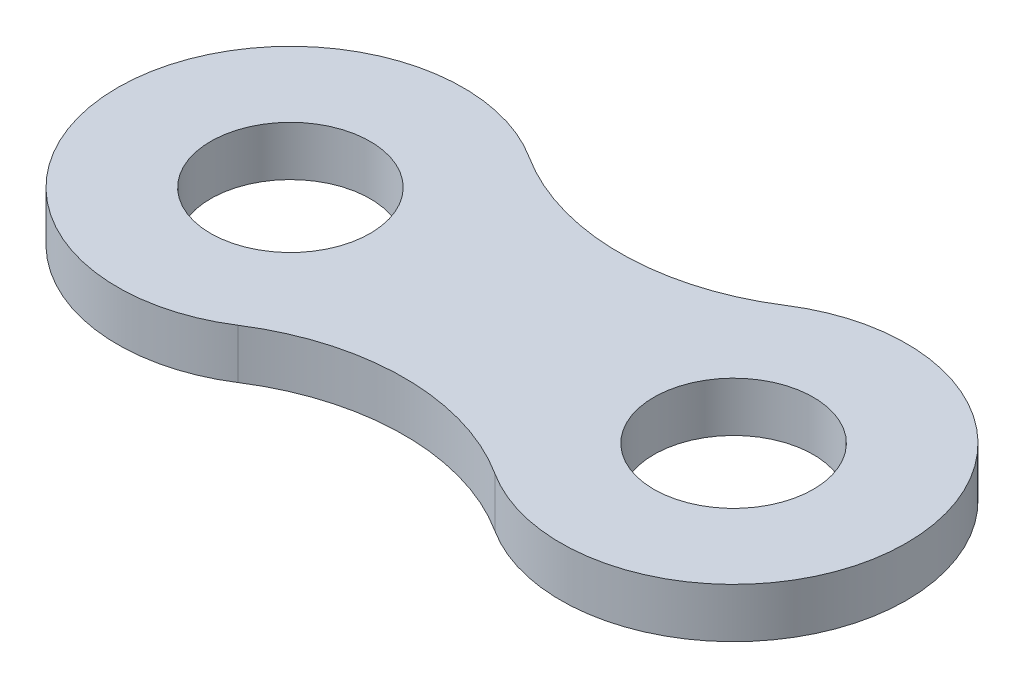
ISO-10303-21;
HEADER;
FILE_DESCRIPTION(('STEP AP214'),'2;1');
FILE_NAME('part.step','',(''),(''),'','','');
FILE_SCHEMA(('AUTOMOTIVE_DESIGN { 1 0 10303 214 1 1 1 1 }'));
ENDSEC;
DATA;
#1=APPLICATION_CONTEXT('core data for automotive mechanical design processes');
#2=APPLICATION_PROTOCOL_DEFINITION('international standard','automotive_design',2000,#1);
#3=PRODUCT_CONTEXT('',#1,'mechanical');
#4=PRODUCT('Part','Part','',(#3));
#5=PRODUCT_RELATED_PRODUCT_CATEGORY('part','',(#4));
#6=PRODUCT_DEFINITION_FORMATION('','',#4);
#7=PRODUCT_DEFINITION_CONTEXT('part definition',#1,'design');
#8=PRODUCT_DEFINITION('design','',#6,#7);
#9=PRODUCT_DEFINITION_SHAPE('','',#8);
#10=(LENGTH_UNIT() NAMED_UNIT(*) SI_UNIT(.MILLI.,.METRE.));
#11=(NAMED_UNIT(*) PLANE_ANGLE_UNIT() SI_UNIT($,.RADIAN.));
#12=(NAMED_UNIT(*) SI_UNIT($,.STERADIAN.) SOLID_ANGLE_UNIT());
#13=UNCERTAINTY_MEASURE_WITH_UNIT(LENGTH_MEASURE(1.E-05),#10,'distance_accuracy_value','');
#14=(GEOMETRIC_REPRESENTATION_CONTEXT(3) GLOBAL_UNCERTAINTY_ASSIGNED_CONTEXT((#13)) GLOBAL_UNIT_ASSIGNED_CONTEXT((#10,
#11,#12)) REPRESENTATION_CONTEXT('',''));
#15=CARTESIAN_POINT('',(0.,0.,0.));
#16=DIRECTION('',(0.,0.,1.));
#17=DIRECTION('',(1.,0.,0.));
#18=AXIS2_PLACEMENT_3D('',#15,#16,#17);
#19=CARTESIAN_POINT('',(4.7625,0.7112,-2.4765));
#20=DIRECTION('',(0.,1.,0.));
#21=DIRECTION('',(0.,0.,1.));
#22=AXIS2_PLACEMENT_3D('',#19,#20,#21);
#23=PLANE('',#22);
#24=CARTESIAN_POINT('',(0.,0.7112,0.));
#25=DIRECTION('',(0.,1.,0.));
#26=DIRECTION('',(0.,0.,1.));
#27=AXIS2_PLACEMENT_3D('',#24,#25,#26);
#28=CIRCLE('',#27,1.143);
#29=CARTESIAN_POINT('',(0.,0.7112,1.143));
#30=VERTEX_POINT('',#29);
#31=EDGE_CURVE('E100',#30,#30,#28,.T.);
#32=ORIENTED_EDGE('',*,*,#31,.F.);
#33=EDGE_LOOP('',(#32));
#34=FACE_BOUND('',#33,.T.);
#35=CARTESIAN_POINT('',(3.175,0.7112,-4.953));
#36=DIRECTION('',(0.,-1.,0.));
#37=DIRECTION('',(0.,0.,1.));
#38=AXIS2_PLACEMENT_3D('',#35,#36,#37);
#39=CIRCLE('',#38,3.40676728952544);
#40=CARTESIAN_POINT('',(5.01351686689485,0.7112,-2.08491368764403));
#41=VERTEX_POINT('',#40);
#42=CARTESIAN_POINT('',(1.33648313310515,0.7112,-2.08491368764403));
#43=VERTEX_POINT('',#42);
#44=EDGE_CURVE('E85',#41,#43,#39,.T.);
#45=ORIENTED_EDGE('',*,*,#44,.T.);
#46=CARTESIAN_POINT('',(0.,0.7112,0.));
#47=DIRECTION('',(0.,1.,0.));
#48=DIRECTION('',(0.,0.,1.));
#49=AXIS2_PLACEMENT_3D('',#46,#47,#48);
#50=CIRCLE('',#49,2.4765);
#51=CARTESIAN_POINT('',(1.33648313310515,0.7112,2.08491368764403));
#52=VERTEX_POINT('',#51);
#53=EDGE_CURVE('E80',#43,#52,#50,.T.);
#54=ORIENTED_EDGE('',*,*,#53,.T.);
#55=CARTESIAN_POINT('',(3.175,0.7112,4.953));
#56=DIRECTION('',(0.,-1.,0.));
#57=DIRECTION('',(0.,0.,-1.));
#58=AXIS2_PLACEMENT_3D('',#55,#56,#57);
#59=CIRCLE('',#58,3.40676728952544);
#60=CARTESIAN_POINT('',(5.01351686689485,0.7112,2.08491368764403));
#61=VERTEX_POINT('',#60);
#62=EDGE_CURVE('E83',#52,#61,#59,.T.);
#63=ORIENTED_EDGE('',*,*,#62,.T.);
#64=CARTESIAN_POINT('',(6.35,0.7112,0.));
#65=DIRECTION('',(0.,1.,0.));
#66=DIRECTION('',(0.,0.,1.));
#67=AXIS2_PLACEMENT_3D('',#64,#65,#66);
#68=CIRCLE('',#67,2.4765);
#69=EDGE_CURVE('E50',#61,#41,#68,.T.);
#70=ORIENTED_EDGE('',*,*,#69,.T.);
#71=EDGE_LOOP('',(#45,#54,#63,#70));
#72=FACE_BOUND('',#71,.T.);
#73=CARTESIAN_POINT('',(6.35,0.7112,0.));
#74=DIRECTION('',(0.,1.,0.));
#75=DIRECTION('',(0.,0.,1.));
#76=AXIS2_PLACEMENT_3D('',#73,#74,#75);
#77=CIRCLE('',#76,1.143);
#78=CARTESIAN_POINT('',(6.35,0.7112,1.143));
#79=VERTEX_POINT('',#78);
#80=EDGE_CURVE('E115',#79,#79,#77,.T.);
#81=ORIENTED_EDGE('',*,*,#80,.F.);
#82=EDGE_LOOP('',(#81));
#83=FACE_BOUND('',#82,.T.);
#84=ADVANCED_FACE('F33',(#34,#72,#83),#23,.T.);
#85=CARTESIAN_POINT('',(4.7625,0.,-2.4765));
#86=DIRECTION('',(0.,1.,0.));
#87=DIRECTION('',(0.,0.,1.));
#88=AXIS2_PLACEMENT_3D('',#85,#86,#87);
#89=PLANE('',#88);
#90=CARTESIAN_POINT('',(3.175,0.,-4.953));
#91=DIRECTION('',(0.,-1.,0.));
#92=DIRECTION('',(0.,0.,1.));
#93=AXIS2_PLACEMENT_3D('',#90,#91,#92);
#94=CIRCLE('',#93,3.40676728952544);
#95=CARTESIAN_POINT('',(5.01351686689485,0.,-2.08491368764403));
#96=VERTEX_POINT('',#95);
#97=CARTESIAN_POINT('',(1.33648313310515,0.,-2.08491368764403));
#98=VERTEX_POINT('',#97);
#99=EDGE_CURVE('E97',#96,#98,#94,.T.);
#100=ORIENTED_EDGE('',*,*,#99,.F.);
#101=CARTESIAN_POINT('',(6.35,0.,0.));
#102=DIRECTION('',(0.,1.,0.));
#103=DIRECTION('',(0.,0.,1.));
#104=AXIS2_PLACEMENT_3D('',#101,#102,#103);
#105=CIRCLE('',#104,2.4765);
#106=CARTESIAN_POINT('',(5.01351686689485,0.,2.08491368764403));
#107=VERTEX_POINT('',#106);
#108=EDGE_CURVE('E73',#107,#96,#105,.T.);
#109=ORIENTED_EDGE('',*,*,#108,.F.);
#110=CARTESIAN_POINT('',(3.175,0.,4.953));
#111=DIRECTION('',(0.,-1.,0.));
#112=DIRECTION('',(0.,0.,-1.));
#113=AXIS2_PLACEMENT_3D('',#110,#111,#112);
#114=CIRCLE('',#113,3.40676728952544);
#115=CARTESIAN_POINT('',(1.33648313310515,0.,2.08491368764403));
#116=VERTEX_POINT('',#115);
#117=EDGE_CURVE('E67',#116,#107,#114,.T.);
#118=ORIENTED_EDGE('',*,*,#117,.F.);
#119=CARTESIAN_POINT('',(0.,0.,0.));
#120=DIRECTION('',(0.,1.,0.));
#121=DIRECTION('',(0.,0.,1.));
#122=AXIS2_PLACEMENT_3D('',#119,#120,#121);
#123=CIRCLE('',#122,2.4765);
#124=EDGE_CURVE('E89',#98,#116,#123,.T.);
#125=ORIENTED_EDGE('',*,*,#124,.F.);
#126=EDGE_LOOP('',(#100,#109,#118,#125));
#127=FACE_BOUND('',#126,.T.);
#128=CARTESIAN_POINT('',(0.,0.,0.));
#129=DIRECTION('',(0.,1.,0.));
#130=DIRECTION('',(0.,0.,1.));
#131=AXIS2_PLACEMENT_3D('',#128,#129,#130);
#132=CIRCLE('',#131,1.143);
#133=CARTESIAN_POINT('',(0.,0.,1.143));
#134=VERTEX_POINT('',#133);
#135=EDGE_CURVE('E112',#134,#134,#132,.T.);
#136=ORIENTED_EDGE('',*,*,#135,.T.);
#137=EDGE_LOOP('',(#136));
#138=FACE_BOUND('',#137,.T.);
#139=CARTESIAN_POINT('',(6.35,0.,0.));
#140=DIRECTION('',(0.,1.,0.));
#141=DIRECTION('',(0.,0.,1.));
#142=AXIS2_PLACEMENT_3D('',#139,#140,#141);
#143=CIRCLE('',#142,1.143);
#144=CARTESIAN_POINT('',(6.35,0.,1.143));
#145=VERTEX_POINT('',#144);
#146=EDGE_CURVE('E118',#145,#145,#143,.T.);
#147=ORIENTED_EDGE('',*,*,#146,.T.);
#148=EDGE_LOOP('',(#147));
#149=FACE_BOUND('',#148,.T.);
#150=ADVANCED_FACE('F108',(#127,#138,#149),#89,.F.);
#151=CARTESIAN_POINT('',(3.175,0.7112,-4.953));
#152=DIRECTION('',(0.,-1.,0.));
#153=DIRECTION('',(0.,0.,-1.));
#154=AXIS2_PLACEMENT_3D('',#151,#152,#153);
#155=CYLINDRICAL_SURFACE('',#154,3.40676728952544);
#156=ORIENTED_EDGE('',*,*,#99,.T.);
#157=DIRECTION('',(0.,-1.,0.));
#158=VECTOR('',#157,1.);
#159=CARTESIAN_POINT('',(1.33648313310515,0.7112,-2.08491368764403));
#160=LINE('',#159,#158);
#161=EDGE_CURVE('E11',#43,#98,#160,.T.);
#162=ORIENTED_EDGE('',*,*,#161,.F.);
#163=ORIENTED_EDGE('',*,*,#44,.F.);
#164=DIRECTION('',(0.,-1.,0.));
#165=VECTOR('',#164,1.);
#166=CARTESIAN_POINT('',(5.01351686689485,0.7112,-2.08491368764403));
#167=LINE('',#166,#165);
#168=EDGE_CURVE('E93',#41,#96,#167,.T.);
#169=ORIENTED_EDGE('',*,*,#168,.T.);
#170=EDGE_LOOP('',(#156,#162,#163,#169));
#171=FACE_BOUND('',#170,.T.);
#172=ADVANCED_FACE('F35',(#171),#155,.F.);
#173=CARTESIAN_POINT('',(0.,0.7112,0.));
#174=DIRECTION('',(0.,-1.,0.));
#175=DIRECTION('',(0.,0.,-1.));
#176=AXIS2_PLACEMENT_3D('',#173,#174,#175);
#177=CYLINDRICAL_SURFACE('',#176,2.4765);
#178=ORIENTED_EDGE('',*,*,#124,.T.);
#179=DIRECTION('',(0.,-1.,0.));
#180=VECTOR('',#179,1.);
#181=CARTESIAN_POINT('',(1.33648313310515,0.7112,2.08491368764403));
#182=LINE('',#181,#180);
#183=EDGE_CURVE('E42',#52,#116,#182,.T.);
#184=ORIENTED_EDGE('',*,*,#183,.F.);
#185=ORIENTED_EDGE('',*,*,#53,.F.);
#186=ORIENTED_EDGE('',*,*,#161,.T.);
#187=EDGE_LOOP('',(#178,#184,#185,#186));
#188=FACE_BOUND('',#187,.T.);
#189=ADVANCED_FACE('F88',(#188),#177,.T.);
#190=CARTESIAN_POINT('',(3.175,0.7112,4.953));
#191=DIRECTION('',(0.,-1.,0.));
#192=DIRECTION('',(0.,0.,-1.));
#193=AXIS2_PLACEMENT_3D('',#190,#191,#192);
#194=CYLINDRICAL_SURFACE('',#193,3.40676728952544);
#195=ORIENTED_EDGE('',*,*,#117,.T.);
#196=DIRECTION('',(0.,-1.,0.));
#197=VECTOR('',#196,1.);
#198=CARTESIAN_POINT('',(5.01351686689485,0.7112,2.08491368764403));
#199=LINE('',#198,#197);
#200=EDGE_CURVE('E90',#61,#107,#199,.T.);
#201=ORIENTED_EDGE('',*,*,#200,.F.);
#202=ORIENTED_EDGE('',*,*,#62,.F.);
#203=ORIENTED_EDGE('',*,*,#183,.T.);
#204=EDGE_LOOP('',(#195,#201,#202,#203));
#205=FACE_BOUND('',#204,.T.);
#206=ADVANCED_FACE('F91',(#205),#194,.F.);
#207=CARTESIAN_POINT('',(6.35,0.7112,0.));
#208=DIRECTION('',(0.,-1.,0.));
#209=DIRECTION('',(0.,0.,-1.));
#210=AXIS2_PLACEMENT_3D('',#207,#208,#209);
#211=CYLINDRICAL_SURFACE('',#210,2.4765);
#212=ORIENTED_EDGE('',*,*,#108,.T.);
#213=ORIENTED_EDGE('',*,*,#168,.F.);
#214=ORIENTED_EDGE('',*,*,#69,.F.);
#215=ORIENTED_EDGE('',*,*,#200,.T.);
#216=EDGE_LOOP('',(#212,#213,#214,#215));
#217=FACE_BOUND('',#216,.T.);
#218=ADVANCED_FACE('F105',(#217),#211,.T.);
#219=CARTESIAN_POINT('',(0.,0.7112,0.));
#220=DIRECTION('',(0.,-1.,0.));
#221=DIRECTION('',(0.,0.,-1.));
#222=AXIS2_PLACEMENT_3D('',#219,#220,#221);
#223=CYLINDRICAL_SURFACE('',#222,1.143);
#224=ORIENTED_EDGE('',*,*,#31,.T.);
#225=EDGE_LOOP('',(#224));
#226=FACE_BOUND('',#225,.T.);
#227=ORIENTED_EDGE('',*,*,#135,.F.);
#228=EDGE_LOOP('',(#227));
#229=FACE_BOUND('',#228,.T.);
#230=ADVANCED_FACE('F135',(#226,#229),#223,.F.);
#231=CARTESIAN_POINT('',(6.35,0.7112,0.));
#232=DIRECTION('',(0.,-1.,0.));
#233=DIRECTION('',(0.,0.,-1.));
#234=AXIS2_PLACEMENT_3D('',#231,#232,#233);
#235=CYLINDRICAL_SURFACE('',#234,1.143);
#236=ORIENTED_EDGE('',*,*,#80,.T.);
#237=EDGE_LOOP('',(#236));
#238=FACE_BOUND('',#237,.T.);
#239=ORIENTED_EDGE('',*,*,#146,.F.);
#240=EDGE_LOOP('',(#239));
#241=FACE_BOUND('',#240,.T.);
#242=ADVANCED_FACE('F124',(#238,#241),#235,.F.);
#243=CLOSED_SHELL('',(#84,#150,#172,#189,#206,#218,#230,#242));
#244=MANIFOLD_SOLID_BREP('B2',#243);
#245=ADVANCED_BREP_SHAPE_REPRESENTATION('',(#18,#244),#14);
#246=SHAPE_DEFINITION_REPRESENTATION(#9,#245);
ENDSEC;
END-ISO-10303-21;
